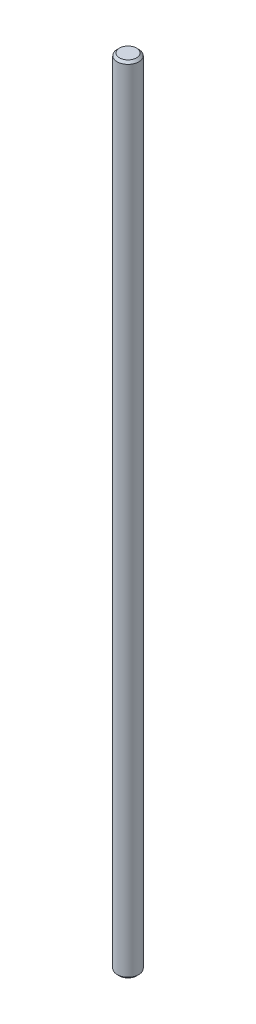
ISO-10303-21;
HEADER;
FILE_DESCRIPTION(('STEP AP214'),'2;1');
FILE_NAME('part.step','',(''),(''),'','','');
FILE_SCHEMA(('AUTOMOTIVE_DESIGN { 1 0 10303 214 1 1 1 1 }'));
ENDSEC;
DATA;
#1=APPLICATION_CONTEXT('core data for automotive mechanical design processes');
#2=APPLICATION_PROTOCOL_DEFINITION('international standard','automotive_design',2000,#1);
#3=PRODUCT_CONTEXT('',#1,'mechanical');
#4=PRODUCT('Part','Part','',(#3));
#5=PRODUCT_RELATED_PRODUCT_CATEGORY('part','',(#4));
#6=PRODUCT_DEFINITION_FORMATION('','',#4);
#7=PRODUCT_DEFINITION_CONTEXT('part definition',#1,'design');
#8=PRODUCT_DEFINITION('design','',#6,#7);
#9=PRODUCT_DEFINITION_SHAPE('','',#8);
#10=(LENGTH_UNIT() NAMED_UNIT(*) SI_UNIT(.MILLI.,.METRE.));
#11=(NAMED_UNIT(*) PLANE_ANGLE_UNIT() SI_UNIT($,.RADIAN.));
#12=(NAMED_UNIT(*) SI_UNIT($,.STERADIAN.) SOLID_ANGLE_UNIT());
#13=UNCERTAINTY_MEASURE_WITH_UNIT(LENGTH_MEASURE(1.E-05),#10,'distance_accuracy_value','');
#14=(GEOMETRIC_REPRESENTATION_CONTEXT(3) GLOBAL_UNCERTAINTY_ASSIGNED_CONTEXT((#13)) GLOBAL_UNIT_ASSIGNED_CONTEXT((#10,
#11,#12)) REPRESENTATION_CONTEXT('',''));
#15=CARTESIAN_POINT('',(0.,0.,0.));
#16=DIRECTION('',(0.,0.,1.));
#17=DIRECTION('',(1.,0.,0.));
#18=AXIS2_PLACEMENT_3D('',#15,#16,#17);
#19=CARTESIAN_POINT('',(0.,140.,0.));
#20=DIRECTION('',(0.,-1.,0.));
#21=DIRECTION('',(0.,0.,-1.));
#22=AXIS2_PLACEMENT_3D('',#19,#20,#21);
#23=CYLINDRICAL_SURFACE('',#22,1.9);
#24=CARTESIAN_POINT('',(0.,0.400000000000011,0.));
#25=DIRECTION('',(0.,1.,0.));
#26=DIRECTION('',(0.,0.,1.));
#27=AXIS2_PLACEMENT_3D('',#24,#25,#26);
#28=CIRCLE('',#27,1.9);
#29=CARTESIAN_POINT('',(0.,0.400000000000011,1.9));
#30=VERTEX_POINT('',#29);
#31=EDGE_CURVE('E46',#30,#30,#28,.T.);
#32=ORIENTED_EDGE('',*,*,#31,.T.);
#33=EDGE_LOOP('',(#32));
#34=FACE_BOUND('',#33,.T.);
#35=CARTESIAN_POINT('',(0.,139.6,0.));
#36=DIRECTION('',(0.,1.,0.));
#37=DIRECTION('',(0.,0.,1.));
#38=AXIS2_PLACEMENT_3D('',#35,#36,#37);
#39=CIRCLE('',#38,1.9);
#40=CARTESIAN_POINT('',(0.,139.6,1.9));
#41=VERTEX_POINT('',#40);
#42=EDGE_CURVE('E50',#41,#41,#39,.F.);
#43=ORIENTED_EDGE('',*,*,#42,.T.);
#44=EDGE_LOOP('',(#43));
#45=FACE_BOUND('',#44,.T.);
#46=ADVANCED_FACE('F34',(#34,#45),#23,.T.);
#47=CARTESIAN_POINT('',(0.,140.,0.));
#48=DIRECTION('',(0.,1.,0.));
#49=DIRECTION('',(0.,0.,1.));
#50=AXIS2_PLACEMENT_3D('',#47,#48,#49);
#51=PLANE('',#50);
#52=CARTESIAN_POINT('',(0.,140.,0.));
#53=DIRECTION('',(0.,1.,0.));
#54=DIRECTION('',(0.,0.,1.));
#55=AXIS2_PLACEMENT_3D('',#52,#53,#54);
#56=CIRCLE('',#55,1.49999999999997);
#57=CARTESIAN_POINT('',(0.,140.,1.49999999999997));
#58=VERTEX_POINT('',#57);
#59=EDGE_CURVE('E10',#58,#58,#56,.T.);
#60=ORIENTED_EDGE('',*,*,#59,.T.);
#61=EDGE_LOOP('',(#60));
#62=FACE_BOUND('',#61,.T.);
#63=ADVANCED_FACE('F66',(#62),#51,.T.);
#64=CARTESIAN_POINT('',(0.,0.,0.));
#65=DIRECTION('',(0.,1.,0.));
#66=DIRECTION('',(0.,0.,1.));
#67=AXIS2_PLACEMENT_3D('',#64,#65,#66);
#68=PLANE('',#67);
#69=CARTESIAN_POINT('',(0.,0.,0.));
#70=DIRECTION('',(0.,1.,0.));
#71=DIRECTION('',(0.,0.,1.));
#72=AXIS2_PLACEMENT_3D('',#69,#70,#71);
#73=CIRCLE('',#72,1.49999999999999);
#74=CARTESIAN_POINT('',(0.,0.,1.49999999999999));
#75=VERTEX_POINT('',#74);
#76=EDGE_CURVE('E42',#75,#75,#73,.F.);
#77=ORIENTED_EDGE('',*,*,#76,.T.);
#78=EDGE_LOOP('',(#77));
#79=FACE_BOUND('',#78,.T.);
#80=ADVANCED_FACE('F63',(#79),#68,.F.);
#81=CARTESIAN_POINT('',(0.,0.400000000000011,0.));
#82=DIRECTION('',(0.,1.,0.));
#83=DIRECTION('',(0.,0.,1.));
#84=AXIS2_PLACEMENT_3D('',#81,#82,#83);
#85=CONICAL_SURFACE('',#84,1.9,0.785398163397449);
#86=ORIENTED_EDGE('',*,*,#76,.F.);
#87=EDGE_LOOP('',(#86));
#88=FACE_BOUND('',#87,.T.);
#89=ORIENTED_EDGE('',*,*,#31,.F.);
#90=EDGE_LOOP('',(#89));
#91=FACE_BOUND('',#90,.T.);
#92=ADVANCED_FACE('F59',(#88,#91),#85,.T.);
#93=CARTESIAN_POINT('',(0.,140.,0.));
#94=DIRECTION('',(0.,-1.,0.));
#95=DIRECTION('',(0.,0.,-1.));
#96=AXIS2_PLACEMENT_3D('',#93,#94,#95);
#97=CONICAL_SURFACE('',#96,1.49999999999997,0.785398163397432);
#98=ORIENTED_EDGE('',*,*,#42,.F.);
#99=EDGE_LOOP('',(#98));
#100=FACE_BOUND('',#99,.T.);
#101=ORIENTED_EDGE('',*,*,#59,.F.);
#102=EDGE_LOOP('',(#101));
#103=FACE_BOUND('',#102,.T.);
#104=ADVANCED_FACE('F37',(#100,#103),#97,.T.);
#105=CLOSED_SHELL('',(#46,#63,#80,#92,#104));
#106=MANIFOLD_SOLID_BREP('B2',#105);
#107=ADVANCED_BREP_SHAPE_REPRESENTATION('',(#18,#106),#14);
#108=SHAPE_DEFINITION_REPRESENTATION(#9,#107);
ENDSEC;
END-ISO-10303-21;
